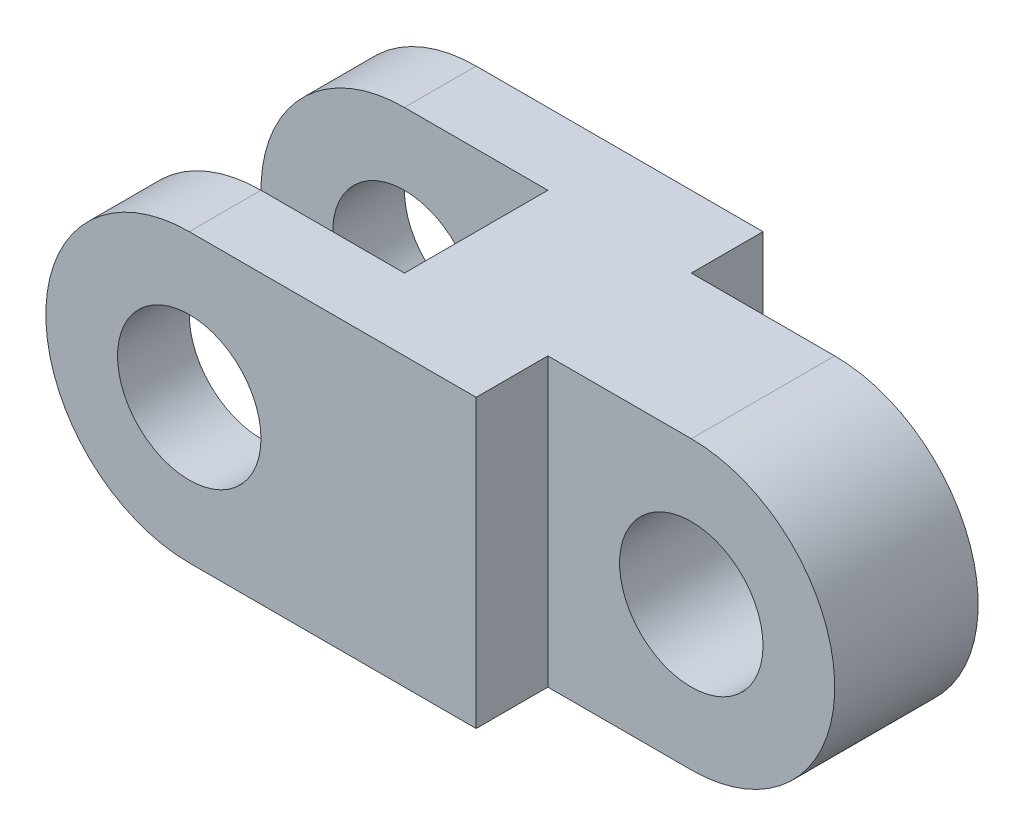
ISO-10303-21;
HEADER;
FILE_DESCRIPTION(('STEP AP214'),'2;1');
FILE_NAME('part.step','',(''),(''),'','','');
FILE_SCHEMA(('AUTOMOTIVE_DESIGN { 1 0 10303 214 1 1 1 1 }'));
ENDSEC;
DATA;
#1=APPLICATION_CONTEXT('core data for automotive mechanical design processes');
#2=APPLICATION_PROTOCOL_DEFINITION('international standard','automotive_design',2000,#1);
#3=PRODUCT_CONTEXT('',#1,'mechanical');
#4=PRODUCT('Part','Part','',(#3));
#5=PRODUCT_RELATED_PRODUCT_CATEGORY('part','',(#4));
#6=PRODUCT_DEFINITION_FORMATION('','',#4);
#7=PRODUCT_DEFINITION_CONTEXT('part definition',#1,'design');
#8=PRODUCT_DEFINITION('design','',#6,#7);
#9=PRODUCT_DEFINITION_SHAPE('','',#8);
#10=(LENGTH_UNIT() NAMED_UNIT(*) SI_UNIT(.MILLI.,.METRE.));
#11=(NAMED_UNIT(*) PLANE_ANGLE_UNIT() SI_UNIT($,.RADIAN.));
#12=(NAMED_UNIT(*) SI_UNIT($,.STERADIAN.) SOLID_ANGLE_UNIT());
#13=UNCERTAINTY_MEASURE_WITH_UNIT(LENGTH_MEASURE(1.E-05),#10,'distance_accuracy_value','');
#14=(GEOMETRIC_REPRESENTATION_CONTEXT(3) GLOBAL_UNCERTAINTY_ASSIGNED_CONTEXT((#13)) GLOBAL_UNIT_ASSIGNED_CONTEXT((#10,
#11,#12)) REPRESENTATION_CONTEXT('',''));
#15=CARTESIAN_POINT('',(0.,0.,0.));
#16=DIRECTION('',(0.,0.,1.));
#17=DIRECTION('',(1.,0.,0.));
#18=AXIS2_PLACEMENT_3D('',#15,#16,#17);
#19=CARTESIAN_POINT('',(75.,0.,50.));
#20=DIRECTION('',(0.,0.,-1.));
#21=DIRECTION('',(-1.,0.,0.));
#22=AXIS2_PLACEMENT_3D('',#19,#20,#21);
#23=CYLINDRICAL_SURFACE('',#22,50.);
#24=CARTESIAN_POINT('',(75.,0.,-25.));
#25=DIRECTION('',(0.,0.,1.));
#26=DIRECTION('',(1.,0.,0.));
#27=AXIS2_PLACEMENT_3D('',#24,#25,#26);
#28=CIRCLE('',#27,50.);
#29=CARTESIAN_POINT('',(75.,-50.,-25.));
#30=VERTEX_POINT('',#29);
#31=CARTESIAN_POINT('',(75.,50.,-25.));
#32=VERTEX_POINT('',#31);
#33=EDGE_CURVE('E135',#30,#32,#28,.T.);
#34=ORIENTED_EDGE('',*,*,#33,.T.);
#35=DIRECTION('',(0.,0.,-1.));
#36=VECTOR('',#35,1.);
#37=CARTESIAN_POINT('',(75.,50.,50.));
#38=LINE('',#37,#36);
#39=CARTESIAN_POINT('',(75.,50.,25.));
#40=VERTEX_POINT('',#39);
#41=EDGE_CURVE('E149',#40,#32,#38,.T.);
#42=ORIENTED_EDGE('',*,*,#41,.F.);
#43=CARTESIAN_POINT('',(75.,0.,25.));
#44=DIRECTION('',(0.,0.,1.));
#45=DIRECTION('',(1.,0.,0.));
#46=AXIS2_PLACEMENT_3D('',#43,#44,#45);
#47=CIRCLE('',#46,50.);
#48=CARTESIAN_POINT('',(75.,-50.,25.));
#49=VERTEX_POINT('',#48);
#50=EDGE_CURVE('E242',#49,#40,#47,.T.);
#51=ORIENTED_EDGE('',*,*,#50,.F.);
#52=DIRECTION('',(0.,0.,-1.));
#53=VECTOR('',#52,1.);
#54=CARTESIAN_POINT('',(75.,-50.,50.));
#55=LINE('',#54,#53);
#56=EDGE_CURVE('E151',#49,#30,#55,.T.);
#57=ORIENTED_EDGE('',*,*,#56,.T.);
#58=EDGE_LOOP('',(#34,#42,#51,#57));
#59=FACE_BOUND('',#58,.T.);
#60=ADVANCED_FACE('F41',(#59),#23,.T.);
#61=CARTESIAN_POINT('',(75.,0.,-50.));
#62=DIRECTION('',(0.,0.,1.));
#63=DIRECTION('',(1.,0.,0.));
#64=AXIS2_PLACEMENT_3D('',#61,#62,#63);
#65=CYLINDRICAL_SURFACE('',#64,25.);
#66=CARTESIAN_POINT('',(75.,0.,25.));
#67=DIRECTION('',(0.,0.,1.));
#68=DIRECTION('',(1.,0.,0.));
#69=AXIS2_PLACEMENT_3D('',#66,#67,#68);
#70=CIRCLE('',#69,25.);
#71=CARTESIAN_POINT('',(100.,0.,25.));
#72=VERTEX_POINT('',#71);
#73=EDGE_CURVE('E249',#72,#72,#70,.F.);
#74=ORIENTED_EDGE('',*,*,#73,.F.);
#75=EDGE_LOOP('',(#74));
#76=FACE_BOUND('',#75,.T.);
#77=CARTESIAN_POINT('',(75.,0.,-25.));
#78=DIRECTION('',(0.,0.,1.));
#79=DIRECTION('',(1.,0.,0.));
#80=AXIS2_PLACEMENT_3D('',#77,#78,#79);
#81=CIRCLE('',#80,25.);
#82=CARTESIAN_POINT('',(100.,0.,-25.));
#83=VERTEX_POINT('',#82);
#84=EDGE_CURVE('E143',#83,#83,#81,.F.);
#85=ORIENTED_EDGE('',*,*,#84,.T.);
#86=EDGE_LOOP('',(#85));
#87=FACE_BOUND('',#86,.T.);
#88=ADVANCED_FACE('F280',(#76,#87),#65,.F.);
#89=CARTESIAN_POINT('',(0.,-50.,50.));
#90=DIRECTION('',(0.,1.,0.));
#91=DIRECTION('',(0.,0.,1.));
#92=AXIS2_PLACEMENT_3D('',#89,#90,#91);
#93=PLANE('',#92);
#94=DIRECTION('',(0.,0.,-1.));
#95=VECTOR('',#94,1.);
#96=CARTESIAN_POINT('',(25.,-50.,-25.));
#97=LINE('',#96,#95);
#98=CARTESIAN_POINT('',(25.,-50.,-25.));
#99=VERTEX_POINT('',#98);
#100=CARTESIAN_POINT('',(25.,-50.,-50.));
#101=VERTEX_POINT('',#100);
#102=EDGE_CURVE('E58',#99,#101,#97,.T.);
#103=ORIENTED_EDGE('',*,*,#102,.F.);
#104=DIRECTION('',(1.,0.,0.));
#105=VECTOR('',#104,1.);
#106=CARTESIAN_POINT('',(0.,-50.,-25.));
#107=LINE('',#106,#105);
#108=EDGE_CURVE('E153',#99,#30,#107,.T.);
#109=ORIENTED_EDGE('',*,*,#108,.T.);
#110=ORIENTED_EDGE('',*,*,#56,.F.);
#111=DIRECTION('',(1.,0.,0.));
#112=VECTOR('',#111,1.);
#113=CARTESIAN_POINT('',(0.,-50.,25.));
#114=LINE('',#113,#112);
#115=CARTESIAN_POINT('',(25.,-50.,25.));
#116=VERTEX_POINT('',#115);
#117=EDGE_CURVE('E253',#116,#49,#114,.T.);
#118=ORIENTED_EDGE('',*,*,#117,.F.);
#119=DIRECTION('',(0.,0.,1.));
#120=VECTOR('',#119,1.);
#121=CARTESIAN_POINT('',(25.,-50.,25.));
#122=LINE('',#121,#120);
#123=CARTESIAN_POINT('',(25.,-50.,50.));
#124=VERTEX_POINT('',#123);
#125=EDGE_CURVE('E239',#116,#124,#122,.T.);
#126=ORIENTED_EDGE('',*,*,#125,.T.);
#127=DIRECTION('',(1.,0.,0.));
#128=VECTOR('',#127,1.);
#129=CARTESIAN_POINT('',(0.,-50.,50.));
#130=LINE('',#129,#128);
#131=CARTESIAN_POINT('',(-75.,-50.,50.));
#132=VERTEX_POINT('',#131);
#133=EDGE_CURVE('E187',#132,#124,#130,.T.);
#134=ORIENTED_EDGE('',*,*,#133,.F.);
#135=DIRECTION('',(0.,0.,-1.));
#136=VECTOR('',#135,1.);
#137=CARTESIAN_POINT('',(-75.,-50.,50.));
#138=LINE('',#137,#136);
#139=CARTESIAN_POINT('',(-75.,-50.,25.));
#140=VERTEX_POINT('',#139);
#141=EDGE_CURVE('E11',#132,#140,#138,.T.);
#142=ORIENTED_EDGE('',*,*,#141,.T.);
#143=DIRECTION('',(-1.,0.,0.));
#144=VECTOR('',#143,1.);
#145=CARTESIAN_POINT('',(0.,-50.,25.));
#146=LINE('',#145,#144);
#147=CARTESIAN_POINT('',(-25.,-50.,25.));
#148=VERTEX_POINT('',#147);
#149=EDGE_CURVE('E212',#148,#140,#146,.T.);
#150=ORIENTED_EDGE('',*,*,#149,.F.);
#151=DIRECTION('',(0.,0.,1.));
#152=VECTOR('',#151,1.);
#153=CARTESIAN_POINT('',(-25.,-50.,0.));
#154=LINE('',#153,#152);
#155=CARTESIAN_POINT('',(-25.,-50.,-25.));
#156=VERTEX_POINT('',#155);
#157=EDGE_CURVE('E223',#156,#148,#154,.T.);
#158=ORIENTED_EDGE('',*,*,#157,.F.);
#159=DIRECTION('',(1.,0.,0.));
#160=VECTOR('',#159,1.);
#161=CARTESIAN_POINT('',(0.,-50.,-25.));
#162=LINE('',#161,#160);
#163=CARTESIAN_POINT('',(-75.,-50.,-25.));
#164=VERTEX_POINT('',#163);
#165=EDGE_CURVE('E205',#164,#156,#162,.T.);
#166=ORIENTED_EDGE('',*,*,#165,.F.);
#167=CARTESIAN_POINT('',(-75.,-50.,-50.));
#168=VERTEX_POINT('',#167);
#169=EDGE_CURVE('E51',#164,#168,#138,.T.);
#170=ORIENTED_EDGE('',*,*,#169,.T.);
#171=DIRECTION('',(1.,0.,0.));
#172=VECTOR('',#171,1.);
#173=CARTESIAN_POINT('',(0.,-50.,-50.));
#174=LINE('',#173,#172);
#175=EDGE_CURVE('E174',#168,#101,#174,.T.);
#176=ORIENTED_EDGE('',*,*,#175,.T.);
#177=EDGE_LOOP('',(#103,#109,#110,#118,#126,#134,#142,#150,#158,#166,#170,#176));
#178=FACE_BOUND('',#177,.T.);
#179=ADVANCED_FACE('F295',(#178),#93,.F.);
#180=CARTESIAN_POINT('',(0.,50.,50.));
#181=DIRECTION('',(0.,1.,0.));
#182=DIRECTION('',(0.,0.,1.));
#183=AXIS2_PLACEMENT_3D('',#180,#181,#182);
#184=PLANE('',#183);
#185=DIRECTION('',(-1.,0.,0.));
#186=VECTOR('',#185,1.);
#187=CARTESIAN_POINT('',(0.,50.,-25.));
#188=LINE('',#187,#186);
#189=CARTESIAN_POINT('',(25.,50.,-25.));
#190=VERTEX_POINT('',#189);
#191=EDGE_CURVE('E131',#32,#190,#188,.T.);
#192=ORIENTED_EDGE('',*,*,#191,.T.);
#193=DIRECTION('',(0.,0.,-1.));
#194=VECTOR('',#193,1.);
#195=CARTESIAN_POINT('',(25.,50.,-25.));
#196=LINE('',#195,#194);
#197=CARTESIAN_POINT('',(25.,50.,-50.));
#198=VERTEX_POINT('',#197);
#199=EDGE_CURVE('E250',#190,#198,#196,.T.);
#200=ORIENTED_EDGE('',*,*,#199,.T.);
#201=DIRECTION('',(1.,0.,0.));
#202=VECTOR('',#201,1.);
#203=CARTESIAN_POINT('',(0.,50.,-50.));
#204=LINE('',#203,#202);
#205=CARTESIAN_POINT('',(-75.,50.,-50.));
#206=VERTEX_POINT('',#205);
#207=EDGE_CURVE('E169',#206,#198,#204,.T.);
#208=ORIENTED_EDGE('',*,*,#207,.F.);
#209=DIRECTION('',(0.,0.,-1.));
#210=VECTOR('',#209,1.);
#211=CARTESIAN_POINT('',(-75.,50.,50.));
#212=LINE('',#211,#210);
#213=CARTESIAN_POINT('',(-75.,50.,-25.));
#214=VERTEX_POINT('',#213);
#215=EDGE_CURVE('E166',#214,#206,#212,.T.);
#216=ORIENTED_EDGE('',*,*,#215,.F.);
#217=DIRECTION('',(1.,0.,0.));
#218=VECTOR('',#217,1.);
#219=CARTESIAN_POINT('',(0.,50.,-25.));
#220=LINE('',#219,#218);
#221=CARTESIAN_POINT('',(-25.,50.,-25.));
#222=VERTEX_POINT('',#221);
#223=EDGE_CURVE('E208',#214,#222,#220,.T.);
#224=ORIENTED_EDGE('',*,*,#223,.T.);
#225=DIRECTION('',(0.,0.,1.));
#226=VECTOR('',#225,1.);
#227=CARTESIAN_POINT('',(-25.,50.,0.));
#228=LINE('',#227,#226);
#229=CARTESIAN_POINT('',(-25.,50.,25.));
#230=VERTEX_POINT('',#229);
#231=EDGE_CURVE('E213',#222,#230,#228,.T.);
#232=ORIENTED_EDGE('',*,*,#231,.T.);
#233=DIRECTION('',(-1.,0.,0.));
#234=VECTOR('',#233,1.);
#235=CARTESIAN_POINT('',(0.,50.,25.));
#236=LINE('',#235,#234);
#237=CARTESIAN_POINT('',(-75.,50.,25.));
#238=VERTEX_POINT('',#237);
#239=EDGE_CURVE('E217',#230,#238,#236,.T.);
#240=ORIENTED_EDGE('',*,*,#239,.T.);
#241=CARTESIAN_POINT('',(-75.,50.,50.));
#242=VERTEX_POINT('',#241);
#243=EDGE_CURVE('E160',#242,#238,#212,.T.);
#244=ORIENTED_EDGE('',*,*,#243,.F.);
#245=DIRECTION('',(1.,0.,0.));
#246=VECTOR('',#245,1.);
#247=CARTESIAN_POINT('',(0.,50.,50.));
#248=LINE('',#247,#246);
#249=CARTESIAN_POINT('',(25.,50.,50.));
#250=VERTEX_POINT('',#249);
#251=EDGE_CURVE('E183',#242,#250,#248,.T.);
#252=ORIENTED_EDGE('',*,*,#251,.T.);
#253=DIRECTION('',(0.,0.,1.));
#254=VECTOR('',#253,1.);
#255=CARTESIAN_POINT('',(25.,50.,25.));
#256=LINE('',#255,#254);
#257=CARTESIAN_POINT('',(25.,50.,25.));
#258=VERTEX_POINT('',#257);
#259=EDGE_CURVE('E66',#258,#250,#256,.T.);
#260=ORIENTED_EDGE('',*,*,#259,.F.);
#261=DIRECTION('',(-1.,0.,0.));
#262=VECTOR('',#261,1.);
#263=CARTESIAN_POINT('',(0.,50.,25.));
#264=LINE('',#263,#262);
#265=EDGE_CURVE('E158',#40,#258,#264,.T.);
#266=ORIENTED_EDGE('',*,*,#265,.F.);
#267=ORIENTED_EDGE('',*,*,#41,.T.);
#268=EDGE_LOOP('',(#192,#200,#208,#216,#224,#232,#240,#244,#252,#260,#266,#267));
#269=FACE_BOUND('',#268,.T.);
#270=ADVANCED_FACE('F156',(#269),#184,.T.);
#271=CARTESIAN_POINT('',(0.,0.,-50.));
#272=DIRECTION('',(0.,0.,1.));
#273=DIRECTION('',(1.,0.,0.));
#274=AXIS2_PLACEMENT_3D('',#271,#272,#273);
#275=PLANE('',#274);
#276=CARTESIAN_POINT('',(-75.,0.,-50.));
#277=DIRECTION('',(0.,0.,1.));
#278=DIRECTION('',(1.,0.,0.));
#279=AXIS2_PLACEMENT_3D('',#276,#277,#278);
#280=CIRCLE('',#279,25.);
#281=CARTESIAN_POINT('',(-50.,0.,-50.));
#282=VERTEX_POINT('',#281);
#283=EDGE_CURVE('E235',#282,#282,#280,.T.);
#284=ORIENTED_EDGE('',*,*,#283,.T.);
#285=EDGE_LOOP('',(#284));
#286=FACE_BOUND('',#285,.T.);
#287=DIRECTION('',(0.,-1.,0.));
#288=VECTOR('',#287,1.);
#289=CARTESIAN_POINT('',(25.,0.,-50.));
#290=LINE('',#289,#288);
#291=EDGE_CURVE('E269',#198,#101,#290,.T.);
#292=ORIENTED_EDGE('',*,*,#291,.T.);
#293=ORIENTED_EDGE('',*,*,#175,.F.);
#294=CARTESIAN_POINT('',(-75.,0.,-50.));
#295=DIRECTION('',(0.,0.,1.));
#296=DIRECTION('',(1.,0.,0.));
#297=AXIS2_PLACEMENT_3D('',#294,#295,#296);
#298=CIRCLE('',#297,50.);
#299=EDGE_CURVE('E178',#206,#168,#298,.T.);
#300=ORIENTED_EDGE('',*,*,#299,.F.);
#301=ORIENTED_EDGE('',*,*,#207,.T.);
#302=EDGE_LOOP('',(#292,#293,#300,#301));
#303=FACE_BOUND('',#302,.T.);
#304=ADVANCED_FACE('F305',(#286,#303),#275,.F.);
#305=CARTESIAN_POINT('',(-75.,0.,50.));
#306=DIRECTION('',(0.,0.,-1.));
#307=DIRECTION('',(-1.,0.,0.));
#308=AXIS2_PLACEMENT_3D('',#305,#306,#307);
#309=CYLINDRICAL_SURFACE('',#308,50.);
#310=CARTESIAN_POINT('',(-75.,0.,-25.));
#311=DIRECTION('',(0.,0.,1.));
#312=DIRECTION('',(1.,0.,0.));
#313=AXIS2_PLACEMENT_3D('',#310,#311,#312);
#314=CIRCLE('',#313,50.);
#315=EDGE_CURVE('E182',#214,#164,#314,.T.);
#316=ORIENTED_EDGE('',*,*,#315,.F.);
#317=ORIENTED_EDGE('',*,*,#215,.T.);
#318=ORIENTED_EDGE('',*,*,#299,.T.);
#319=ORIENTED_EDGE('',*,*,#169,.F.);
#320=EDGE_LOOP('',(#316,#317,#318,#319));
#321=FACE_BOUND('',#320,.T.);
#322=ADVANCED_FACE('F313',(#321),#309,.T.);
#323=ORIENTED_EDGE('',*,*,#243,.T.);
#324=CARTESIAN_POINT('',(-75.,0.,25.));
#325=DIRECTION('',(0.,0.,1.));
#326=DIRECTION('',(1.,0.,0.));
#327=AXIS2_PLACEMENT_3D('',#324,#325,#326);
#328=CIRCLE('',#327,50.);
#329=EDGE_CURVE('E194',#238,#140,#328,.T.);
#330=ORIENTED_EDGE('',*,*,#329,.T.);
#331=ORIENTED_EDGE('',*,*,#141,.F.);
#332=CARTESIAN_POINT('',(-75.,0.,50.));
#333=DIRECTION('',(0.,0.,1.));
#334=DIRECTION('',(1.,0.,0.));
#335=AXIS2_PLACEMENT_3D('',#332,#333,#334);
#336=CIRCLE('',#335,50.);
#337=EDGE_CURVE('E173',#242,#132,#336,.T.);
#338=ORIENTED_EDGE('',*,*,#337,.F.);
#339=EDGE_LOOP('',(#323,#330,#331,#338));
#340=FACE_BOUND('',#339,.T.);
#341=ADVANCED_FACE('F43',(#340),#309,.T.);
#342=CARTESIAN_POINT('',(0.,0.,50.));
#343=DIRECTION('',(0.,0.,1.));
#344=DIRECTION('',(1.,0.,0.));
#345=AXIS2_PLACEMENT_3D('',#342,#343,#344);
#346=PLANE('',#345);
#347=DIRECTION('',(0.,-1.,0.));
#348=VECTOR('',#347,1.);
#349=CARTESIAN_POINT('',(25.,0.,50.));
#350=LINE('',#349,#348);
#351=EDGE_CURVE('E246',#250,#124,#350,.T.);
#352=ORIENTED_EDGE('',*,*,#351,.F.);
#353=ORIENTED_EDGE('',*,*,#251,.F.);
#354=ORIENTED_EDGE('',*,*,#337,.T.);
#355=ORIENTED_EDGE('',*,*,#133,.T.);
#356=EDGE_LOOP('',(#352,#353,#354,#355));
#357=FACE_BOUND('',#356,.T.);
#358=CARTESIAN_POINT('',(-75.,0.,50.));
#359=DIRECTION('',(0.,0.,1.));
#360=DIRECTION('',(1.,0.,0.));
#361=AXIS2_PLACEMENT_3D('',#358,#359,#360);
#362=CIRCLE('',#361,25.);
#363=CARTESIAN_POINT('',(-50.,0.,50.));
#364=VERTEX_POINT('',#363);
#365=EDGE_CURVE('E220',#364,#364,#362,.T.);
#366=ORIENTED_EDGE('',*,*,#365,.F.);
#367=EDGE_LOOP('',(#366));
#368=FACE_BOUND('',#367,.T.);
#369=ADVANCED_FACE('F342',(#357,#368),#346,.T.);
#370=CARTESIAN_POINT('',(0.,0.,-25.));
#371=DIRECTION('',(0.,0.,1.));
#372=DIRECTION('',(1.,0.,0.));
#373=AXIS2_PLACEMENT_3D('',#370,#371,#372);
#374=PLANE('',#373);
#375=CARTESIAN_POINT('',(-75.,0.,-25.));
#376=DIRECTION('',(0.,0.,1.));
#377=DIRECTION('',(1.,0.,0.));
#378=AXIS2_PLACEMENT_3D('',#375,#376,#377);
#379=CIRCLE('',#378,25.);
#380=CARTESIAN_POINT('',(-50.,0.,-25.));
#381=VERTEX_POINT('',#380);
#382=EDGE_CURVE('E231',#381,#381,#379,.T.);
#383=ORIENTED_EDGE('',*,*,#382,.F.);
#384=EDGE_LOOP('',(#383));
#385=FACE_BOUND('',#384,.T.);
#386=ORIENTED_EDGE('',*,*,#315,.T.);
#387=ORIENTED_EDGE('',*,*,#165,.T.);
#388=DIRECTION('',(0.,1.,0.));
#389=VECTOR('',#388,1.);
#390=CARTESIAN_POINT('',(-25.,-50.,-25.));
#391=LINE('',#390,#389);
#392=EDGE_CURVE('E198',#156,#222,#391,.T.);
#393=ORIENTED_EDGE('',*,*,#392,.T.);
#394=ORIENTED_EDGE('',*,*,#223,.F.);
#395=EDGE_LOOP('',(#386,#387,#393,#394));
#396=FACE_BOUND('',#395,.T.);
#397=ADVANCED_FACE('F339',(#385,#396),#374,.T.);
#398=CARTESIAN_POINT('',(0.,0.,25.));
#399=DIRECTION('',(0.,0.,1.));
#400=DIRECTION('',(1.,0.,0.));
#401=AXIS2_PLACEMENT_3D('',#398,#399,#400);
#402=PLANE('',#401);
#403=CARTESIAN_POINT('',(-75.,0.,25.));
#404=DIRECTION('',(0.,0.,1.));
#405=DIRECTION('',(1.,0.,0.));
#406=AXIS2_PLACEMENT_3D('',#403,#404,#405);
#407=CIRCLE('',#406,25.);
#408=CARTESIAN_POINT('',(-50.,0.,25.));
#409=VERTEX_POINT('',#408);
#410=EDGE_CURVE('E45',#409,#409,#407,.T.);
#411=ORIENTED_EDGE('',*,*,#410,.T.);
#412=EDGE_LOOP('',(#411));
#413=FACE_BOUND('',#412,.T.);
#414=ORIENTED_EDGE('',*,*,#329,.F.);
#415=ORIENTED_EDGE('',*,*,#239,.F.);
#416=DIRECTION('',(0.,1.,0.));
#417=VECTOR('',#416,1.);
#418=CARTESIAN_POINT('',(-25.,-50.,25.));
#419=LINE('',#418,#417);
#420=EDGE_CURVE('E202',#148,#230,#419,.T.);
#421=ORIENTED_EDGE('',*,*,#420,.F.);
#422=ORIENTED_EDGE('',*,*,#149,.T.);
#423=EDGE_LOOP('',(#414,#415,#421,#422));
#424=FACE_BOUND('',#423,.T.);
#425=ADVANCED_FACE('F320',(#413,#424),#402,.F.);
#426=CARTESIAN_POINT('',(-25.,-50.,0.));
#427=DIRECTION('',(-1.,0.,0.));
#428=DIRECTION('',(0.,0.,1.));
#429=AXIS2_PLACEMENT_3D('',#426,#427,#428);
#430=PLANE('',#429);
#431=ORIENTED_EDGE('',*,*,#231,.F.);
#432=ORIENTED_EDGE('',*,*,#392,.F.);
#433=ORIENTED_EDGE('',*,*,#157,.T.);
#434=ORIENTED_EDGE('',*,*,#420,.T.);
#435=EDGE_LOOP('',(#431,#432,#433,#434));
#436=FACE_BOUND('',#435,.T.);
#437=ADVANCED_FACE('F326',(#436),#430,.T.);
#438=CARTESIAN_POINT('',(-75.,0.,-50.));
#439=DIRECTION('',(0.,0.,1.));
#440=DIRECTION('',(1.,0.,0.));
#441=AXIS2_PLACEMENT_3D('',#438,#439,#440);
#442=CYLINDRICAL_SURFACE('',#441,25.);
#443=ORIENTED_EDGE('',*,*,#365,.T.);
#444=EDGE_LOOP('',(#443));
#445=FACE_BOUND('',#444,.T.);
#446=ORIENTED_EDGE('',*,*,#410,.F.);
#447=EDGE_LOOP('',(#446));
#448=FACE_BOUND('',#447,.T.);
#449=ADVANCED_FACE('F323',(#445,#448),#442,.F.);
#450=ORIENTED_EDGE('',*,*,#382,.T.);
#451=EDGE_LOOP('',(#450));
#452=FACE_BOUND('',#451,.T.);
#453=ORIENTED_EDGE('',*,*,#283,.F.);
#454=EDGE_LOOP('',(#453));
#455=FACE_BOUND('',#454,.T.);
#456=ADVANCED_FACE('F325',(#452,#455),#442,.F.);
#457=CARTESIAN_POINT('',(25.,0.,25.));
#458=DIRECTION('',(-1.,0.,0.));
#459=DIRECTION('',(0.,-1.,0.));
#460=AXIS2_PLACEMENT_3D('',#457,#458,#459);
#461=PLANE('',#460);
#462=ORIENTED_EDGE('',*,*,#351,.T.);
#463=ORIENTED_EDGE('',*,*,#125,.F.);
#464=DIRECTION('',(0.,-1.,0.));
#465=VECTOR('',#464,1.);
#466=CARTESIAN_POINT('',(25.,0.,25.));
#467=LINE('',#466,#465);
#468=EDGE_CURVE('E256',#258,#116,#467,.T.);
#469=ORIENTED_EDGE('',*,*,#468,.F.);
#470=ORIENTED_EDGE('',*,*,#259,.T.);
#471=EDGE_LOOP('',(#462,#463,#469,#470));
#472=FACE_BOUND('',#471,.T.);
#473=ADVANCED_FACE('F333',(#472),#461,.F.);
#474=CARTESIAN_POINT('',(0.,0.,25.));
#475=DIRECTION('',(0.,0.,1.));
#476=DIRECTION('',(1.,0.,0.));
#477=AXIS2_PLACEMENT_3D('',#474,#475,#476);
#478=PLANE('',#477);
#479=ORIENTED_EDGE('',*,*,#73,.T.);
#480=EDGE_LOOP('',(#479));
#481=FACE_BOUND('',#480,.T.);
#482=ORIENTED_EDGE('',*,*,#265,.T.);
#483=ORIENTED_EDGE('',*,*,#468,.T.);
#484=ORIENTED_EDGE('',*,*,#117,.T.);
#485=ORIENTED_EDGE('',*,*,#50,.T.);
#486=EDGE_LOOP('',(#482,#483,#484,#485));
#487=FACE_BOUND('',#486,.T.);
#488=ADVANCED_FACE('F288',(#481,#487),#478,.T.);
#489=CARTESIAN_POINT('',(25.,0.,-25.));
#490=DIRECTION('',(1.,0.,0.));
#491=DIRECTION('',(0.,1.,0.));
#492=AXIS2_PLACEMENT_3D('',#489,#490,#491);
#493=PLANE('',#492);
#494=ORIENTED_EDGE('',*,*,#291,.F.);
#495=ORIENTED_EDGE('',*,*,#199,.F.);
#496=DIRECTION('',(0.,-1.,0.));
#497=VECTOR('',#496,1.);
#498=CARTESIAN_POINT('',(25.,0.,-25.));
#499=LINE('',#498,#497);
#500=EDGE_CURVE('E137',#190,#99,#499,.T.);
#501=ORIENTED_EDGE('',*,*,#500,.T.);
#502=ORIENTED_EDGE('',*,*,#102,.T.);
#503=EDGE_LOOP('',(#494,#495,#501,#502));
#504=FACE_BOUND('',#503,.T.);
#505=ADVANCED_FACE('F283',(#504),#493,.T.);
#506=CARTESIAN_POINT('',(0.,0.,-25.));
#507=DIRECTION('',(0.,0.,-1.));
#508=DIRECTION('',(1.,0.,0.));
#509=AXIS2_PLACEMENT_3D('',#506,#507,#508);
#510=PLANE('',#509);
#511=ORIENTED_EDGE('',*,*,#84,.F.);
#512=EDGE_LOOP('',(#511));
#513=FACE_BOUND('',#512,.T.);
#514=ORIENTED_EDGE('',*,*,#191,.F.);
#515=ORIENTED_EDGE('',*,*,#33,.F.);
#516=ORIENTED_EDGE('',*,*,#108,.F.);
#517=ORIENTED_EDGE('',*,*,#500,.F.);
#518=EDGE_LOOP('',(#514,#515,#516,#517));
#519=FACE_BOUND('',#518,.T.);
#520=ADVANCED_FACE('F133',(#513,#519),#510,.T.);
#521=CLOSED_SHELL('',(#60,#88,#179,#270,#304,#322,#341,#369,#397,#425,#437,#449,#456,#473,#488,
#505,#520));
#522=MANIFOLD_SOLID_BREP('B2',#521);
#523=ADVANCED_BREP_SHAPE_REPRESENTATION('',(#18,#522),#14);
#524=SHAPE_DEFINITION_REPRESENTATION(#9,#523);
ENDSEC;
END-ISO-10303-21;
